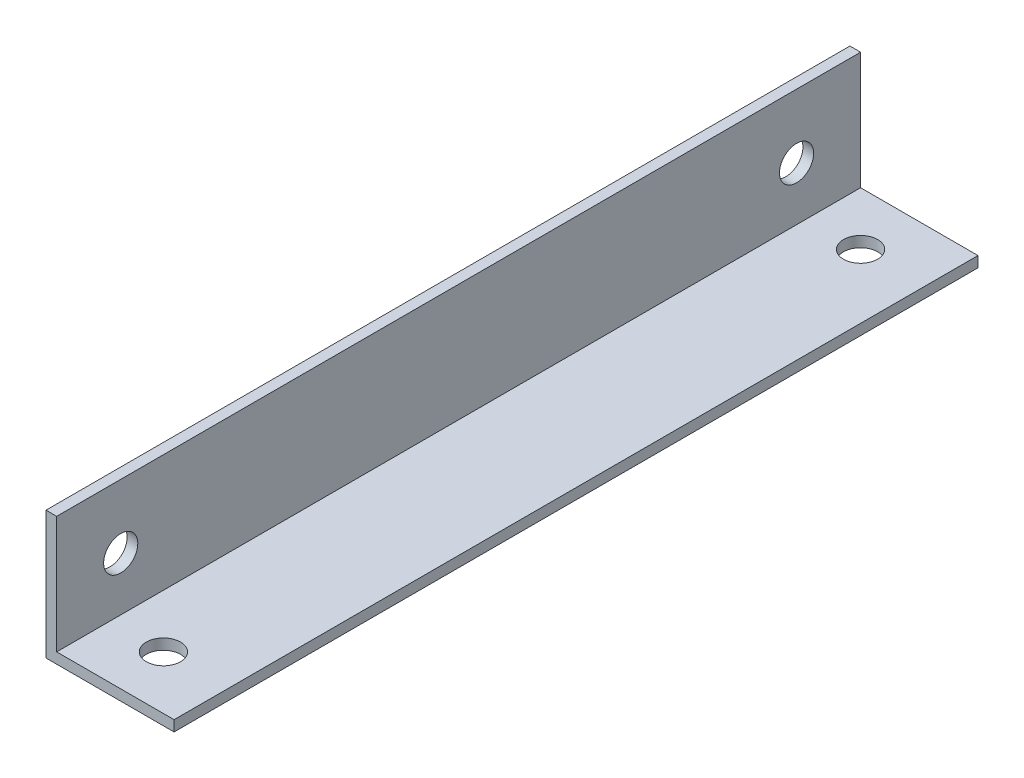
ISO-10303-21;
HEADER;
FILE_DESCRIPTION(('STEP AP214'),'2;1');
FILE_NAME('part.step','',(''),(''),'','','');
FILE_SCHEMA(('AUTOMOTIVE_DESIGN { 1 0 10303 214 1 1 1 1 }'));
ENDSEC;
DATA;
#1=APPLICATION_CONTEXT('core data for automotive mechanical design processes');
#2=APPLICATION_PROTOCOL_DEFINITION('international standard','automotive_design',2000,#1);
#3=PRODUCT_CONTEXT('',#1,'mechanical');
#4=PRODUCT('Part','Part','',(#3));
#5=PRODUCT_RELATED_PRODUCT_CATEGORY('part','',(#4));
#6=PRODUCT_DEFINITION_FORMATION('','',#4);
#7=PRODUCT_DEFINITION_CONTEXT('part definition',#1,'design');
#8=PRODUCT_DEFINITION('design','',#6,#7);
#9=PRODUCT_DEFINITION_SHAPE('','',#8);
#10=(LENGTH_UNIT() NAMED_UNIT(*) SI_UNIT(.MILLI.,.METRE.));
#11=(NAMED_UNIT(*) PLANE_ANGLE_UNIT() SI_UNIT($,.RADIAN.));
#12=(NAMED_UNIT(*) SI_UNIT($,.STERADIAN.) SOLID_ANGLE_UNIT());
#13=UNCERTAINTY_MEASURE_WITH_UNIT(LENGTH_MEASURE(1.E-05),#10,'distance_accuracy_value','');
#14=(GEOMETRIC_REPRESENTATION_CONTEXT(3) GLOBAL_UNCERTAINTY_ASSIGNED_CONTEXT((#13)) GLOBAL_UNIT_ASSIGNED_CONTEXT((#10,
#11,#12)) REPRESENTATION_CONTEXT('',''));
#15=CARTESIAN_POINT('',(0.,0.,0.));
#16=DIRECTION('',(0.,0.,1.));
#17=DIRECTION('',(1.,0.,0.));
#18=AXIS2_PLACEMENT_3D('',#15,#16,#17);
#19=CARTESIAN_POINT('',(30.,0.,188.3));
#20=DIRECTION('',(0.,1.,0.));
#21=DIRECTION('',(-1.,0.,0.));
#22=AXIS2_PLACEMENT_3D('',#19,#20,#21);
#23=PLANE('',#22);
#24=CARTESIAN_POINT('',(15.,0.,175.8));
#25=DIRECTION('',(0.,1.,0.));
#26=DIRECTION('',(1.,0.,0.));
#27=AXIS2_PLACEMENT_3D('',#24,#25,#26);
#28=CIRCLE('',#27,4.);
#29=CARTESIAN_POINT('',(11.,0.,175.8));
#30=VERTEX_POINT('',#29);
#31=EDGE_CURVE('E162',#30,#30,#28,.T.);
#32=ORIENTED_EDGE('',*,*,#31,.T.);
#33=EDGE_LOOP('',(#32));
#34=FACE_BOUND('',#33,.T.);
#35=CARTESIAN_POINT('',(15.,0.,12.5));
#36=DIRECTION('',(0.,1.,0.));
#37=DIRECTION('',(-1.,0.,0.));
#38=AXIS2_PLACEMENT_3D('',#35,#36,#37);
#39=CIRCLE('',#38,4.);
#40=CARTESIAN_POINT('',(11.,0.,12.5));
#41=VERTEX_POINT('',#40);
#42=EDGE_CURVE('E120',#41,#41,#39,.T.);
#43=ORIENTED_EDGE('',*,*,#42,.T.);
#44=EDGE_LOOP('',(#43));
#45=FACE_BOUND('',#44,.T.);
#46=DIRECTION('',(1.,0.,0.));
#47=VECTOR('',#46,1.);
#48=CARTESIAN_POINT('',(30.,0.,0.));
#49=LINE('',#48,#47);
#50=CARTESIAN_POINT('',(0.,0.,0.));
#51=VERTEX_POINT('',#50);
#52=CARTESIAN_POINT('',(30.,0.,0.));
#53=VERTEX_POINT('',#52);
#54=EDGE_CURVE('E116',#51,#53,#49,.T.);
#55=ORIENTED_EDGE('',*,*,#54,.T.);
#56=DIRECTION('',(0.,0.,-1.));
#57=VECTOR('',#56,1.);
#58=CARTESIAN_POINT('',(30.,0.,188.3));
#59=LINE('',#58,#57);
#60=CARTESIAN_POINT('',(30.,0.,188.3));
#61=VERTEX_POINT('',#60);
#62=EDGE_CURVE('E11',#61,#53,#59,.T.);
#63=ORIENTED_EDGE('',*,*,#62,.F.);
#64=DIRECTION('',(1.,0.,0.));
#65=VECTOR('',#64,1.);
#66=CARTESIAN_POINT('',(30.,0.,188.3));
#67=LINE('',#66,#65);
#68=CARTESIAN_POINT('',(0.,0.,188.3));
#69=VERTEX_POINT('',#68);
#70=EDGE_CURVE('E127',#69,#61,#67,.T.);
#71=ORIENTED_EDGE('',*,*,#70,.F.);
#72=DIRECTION('',(0.,0.,-1.));
#73=VECTOR('',#72,1.);
#74=CARTESIAN_POINT('',(0.,0.,188.3));
#75=LINE('',#74,#73);
#76=EDGE_CURVE('E112',#69,#51,#75,.T.);
#77=ORIENTED_EDGE('',*,*,#76,.T.);
#78=EDGE_LOOP('',(#55,#63,#71,#77));
#79=FACE_BOUND('',#78,.T.);
#80=ADVANCED_FACE('F32',(#34,#45,#79),#23,.F.);
#81=CARTESIAN_POINT('',(30.,2.5,188.3));
#82=DIRECTION('',(-1.,0.,0.));
#83=DIRECTION('',(0.,0.,1.));
#84=AXIS2_PLACEMENT_3D('',#81,#82,#83);
#85=PLANE('',#84);
#86=DIRECTION('',(0.,1.,0.));
#87=VECTOR('',#86,1.);
#88=CARTESIAN_POINT('',(30.,2.5,0.));
#89=LINE('',#88,#87);
#90=CARTESIAN_POINT('',(30.,2.5,0.));
#91=VERTEX_POINT('',#90);
#92=EDGE_CURVE('E119',#53,#91,#89,.T.);
#93=ORIENTED_EDGE('',*,*,#92,.T.);
#94=DIRECTION('',(0.,0.,-1.));
#95=VECTOR('',#94,1.);
#96=CARTESIAN_POINT('',(30.,2.5,188.3));
#97=LINE('',#96,#95);
#98=CARTESIAN_POINT('',(30.,2.5,188.3));
#99=VERTEX_POINT('',#98);
#100=EDGE_CURVE('E40',#99,#91,#97,.T.);
#101=ORIENTED_EDGE('',*,*,#100,.F.);
#102=DIRECTION('',(0.,1.,0.));
#103=VECTOR('',#102,1.);
#104=CARTESIAN_POINT('',(30.,2.5,188.3));
#105=LINE('',#104,#103);
#106=EDGE_CURVE('E85',#61,#99,#105,.T.);
#107=ORIENTED_EDGE('',*,*,#106,.F.);
#108=ORIENTED_EDGE('',*,*,#62,.T.);
#109=EDGE_LOOP('',(#93,#101,#107,#108));
#110=FACE_BOUND('',#109,.T.);
#111=ADVANCED_FACE('F154',(#110),#85,.F.);
#112=CARTESIAN_POINT('',(2.5,2.5,188.3));
#113=DIRECTION('',(0.,-1.,0.));
#114=DIRECTION('',(1.,0.,0.));
#115=AXIS2_PLACEMENT_3D('',#112,#113,#114);
#116=PLANE('',#115);
#117=CARTESIAN_POINT('',(15.,2.5,175.8));
#118=DIRECTION('',(0.,1.,0.));
#119=DIRECTION('',(1.,0.,0.));
#120=AXIS2_PLACEMENT_3D('',#117,#118,#119);
#121=CIRCLE('',#120,4.);
#122=CARTESIAN_POINT('',(11.,2.5,175.8));
#123=VERTEX_POINT('',#122);
#124=EDGE_CURVE('E171',#123,#123,#121,.T.);
#125=ORIENTED_EDGE('',*,*,#124,.F.);
#126=EDGE_LOOP('',(#125));
#127=FACE_BOUND('',#126,.T.);
#128=CARTESIAN_POINT('',(15.,2.5,12.5));
#129=DIRECTION('',(0.,1.,0.));
#130=DIRECTION('',(-1.,0.,0.));
#131=AXIS2_PLACEMENT_3D('',#128,#129,#130);
#132=CIRCLE('',#131,4.);
#133=CARTESIAN_POINT('',(11.,2.5,12.5));
#134=VERTEX_POINT('',#133);
#135=EDGE_CURVE('E166',#134,#134,#132,.T.);
#136=ORIENTED_EDGE('',*,*,#135,.F.);
#137=EDGE_LOOP('',(#136));
#138=FACE_BOUND('',#137,.T.);
#139=DIRECTION('',(-1.,0.,0.));
#140=VECTOR('',#139,1.);
#141=CARTESIAN_POINT('',(2.5,2.5,0.));
#142=LINE('',#141,#140);
#143=CARTESIAN_POINT('',(2.5,2.5,0.));
#144=VERTEX_POINT('',#143);
#145=EDGE_CURVE('E122',#91,#144,#142,.T.);
#146=ORIENTED_EDGE('',*,*,#145,.T.);
#147=DIRECTION('',(0.,0.,-1.));
#148=VECTOR('',#147,1.);
#149=CARTESIAN_POINT('',(2.5,2.5,188.3));
#150=LINE('',#149,#148);
#151=CARTESIAN_POINT('',(2.5,2.5,188.3));
#152=VERTEX_POINT('',#151);
#153=EDGE_CURVE('E107',#152,#144,#150,.T.);
#154=ORIENTED_EDGE('',*,*,#153,.F.);
#155=DIRECTION('',(-1.,0.,0.));
#156=VECTOR('',#155,1.);
#157=CARTESIAN_POINT('',(2.5,2.5,188.3));
#158=LINE('',#157,#156);
#159=EDGE_CURVE('E98',#99,#152,#158,.T.);
#160=ORIENTED_EDGE('',*,*,#159,.F.);
#161=ORIENTED_EDGE('',*,*,#100,.T.);
#162=EDGE_LOOP('',(#146,#154,#160,#161));
#163=FACE_BOUND('',#162,.T.);
#164=ADVANCED_FACE('F133',(#127,#138,#163),#116,.F.);
#165=CARTESIAN_POINT('',(2.5,30.,188.3));
#166=DIRECTION('',(-1.,0.,0.));
#167=DIRECTION('',(0.,-1.,0.));
#168=AXIS2_PLACEMENT_3D('',#165,#166,#167);
#169=PLANE('',#168);
#170=CARTESIAN_POINT('',(2.5,15.,173.3));
#171=DIRECTION('',(1.,0.,0.));
#172=DIRECTION('',(0.,-1.,0.));
#173=AXIS2_PLACEMENT_3D('',#170,#171,#172);
#174=CIRCLE('',#173,3.99999999999996);
#175=CARTESIAN_POINT('',(2.5,11.,173.3));
#176=VERTEX_POINT('',#175);
#177=EDGE_CURVE('E184',#176,#176,#174,.T.);
#178=ORIENTED_EDGE('',*,*,#177,.F.);
#179=EDGE_LOOP('',(#178));
#180=FACE_BOUND('',#179,.T.);
#181=CARTESIAN_POINT('',(2.5,15.,15.));
#182=DIRECTION('',(1.,0.,0.));
#183=DIRECTION('',(0.,1.,0.));
#184=AXIS2_PLACEMENT_3D('',#181,#182,#183);
#185=CIRCLE('',#184,4.);
#186=CARTESIAN_POINT('',(2.5,19.,15.));
#187=VERTEX_POINT('',#186);
#188=EDGE_CURVE('E178',#187,#187,#185,.T.);
#189=ORIENTED_EDGE('',*,*,#188,.F.);
#190=EDGE_LOOP('',(#189));
#191=FACE_BOUND('',#190,.T.);
#192=DIRECTION('',(0.,1.,0.));
#193=VECTOR('',#192,1.);
#194=CARTESIAN_POINT('',(2.5,30.,0.));
#195=LINE('',#194,#193);
#196=CARTESIAN_POINT('',(2.5,30.,0.));
#197=VERTEX_POINT('',#196);
#198=EDGE_CURVE('E106',#144,#197,#195,.T.);
#199=ORIENTED_EDGE('',*,*,#198,.T.);
#200=DIRECTION('',(0.,0.,-1.));
#201=VECTOR('',#200,1.);
#202=CARTESIAN_POINT('',(2.5,30.,188.3));
#203=LINE('',#202,#201);
#204=CARTESIAN_POINT('',(2.5,30.,188.3));
#205=VERTEX_POINT('',#204);
#206=EDGE_CURVE('E103',#205,#197,#203,.T.);
#207=ORIENTED_EDGE('',*,*,#206,.F.);
#208=DIRECTION('',(0.,1.,0.));
#209=VECTOR('',#208,1.);
#210=CARTESIAN_POINT('',(2.5,30.,188.3));
#211=LINE('',#210,#209);
#212=EDGE_CURVE('E92',#152,#205,#211,.T.);
#213=ORIENTED_EDGE('',*,*,#212,.F.);
#214=ORIENTED_EDGE('',*,*,#153,.T.);
#215=EDGE_LOOP('',(#199,#207,#213,#214));
#216=FACE_BOUND('',#215,.T.);
#217=ADVANCED_FACE('F104',(#180,#191,#216),#169,.F.);
#218=CARTESIAN_POINT('',(0.,30.,188.3));
#219=DIRECTION('',(0.,-1.,0.));
#220=DIRECTION('',(0.,0.,-1.));
#221=AXIS2_PLACEMENT_3D('',#218,#219,#220);
#222=PLANE('',#221);
#223=DIRECTION('',(-1.,0.,0.));
#224=VECTOR('',#223,1.);
#225=CARTESIAN_POINT('',(0.,30.,0.));
#226=LINE('',#225,#224);
#227=CARTESIAN_POINT('',(0.,30.,0.));
#228=VERTEX_POINT('',#227);
#229=EDGE_CURVE('E71',#197,#228,#226,.T.);
#230=ORIENTED_EDGE('',*,*,#229,.T.);
#231=DIRECTION('',(0.,0.,-1.));
#232=VECTOR('',#231,1.);
#233=CARTESIAN_POINT('',(0.,30.,188.3));
#234=LINE('',#233,#232);
#235=CARTESIAN_POINT('',(0.,30.,188.3));
#236=VERTEX_POINT('',#235);
#237=EDGE_CURVE('E108',#236,#228,#234,.T.);
#238=ORIENTED_EDGE('',*,*,#237,.F.);
#239=DIRECTION('',(-1.,0.,0.));
#240=VECTOR('',#239,1.);
#241=CARTESIAN_POINT('',(0.,30.,188.3));
#242=LINE('',#241,#240);
#243=EDGE_CURVE('E96',#205,#236,#242,.T.);
#244=ORIENTED_EDGE('',*,*,#243,.F.);
#245=ORIENTED_EDGE('',*,*,#206,.T.);
#246=EDGE_LOOP('',(#230,#238,#244,#245));
#247=FACE_BOUND('',#246,.T.);
#248=ADVANCED_FACE('F110',(#247),#222,.F.);
#249=CARTESIAN_POINT('',(0.,0.,188.3));
#250=DIRECTION('',(1.,0.,0.));
#251=DIRECTION('',(0.,0.,-1.));
#252=AXIS2_PLACEMENT_3D('',#249,#250,#251);
#253=PLANE('',#252);
#254=CARTESIAN_POINT('',(0.,15.,173.3));
#255=DIRECTION('',(1.,0.,0.));
#256=DIRECTION('',(0.,-1.,0.));
#257=AXIS2_PLACEMENT_3D('',#254,#255,#256);
#258=CIRCLE('',#257,3.99999999999996);
#259=CARTESIAN_POINT('',(0.,11.,173.3));
#260=VERTEX_POINT('',#259);
#261=EDGE_CURVE('E181',#260,#260,#258,.T.);
#262=ORIENTED_EDGE('',*,*,#261,.T.);
#263=EDGE_LOOP('',(#262));
#264=FACE_BOUND('',#263,.T.);
#265=CARTESIAN_POINT('',(0.,15.,15.));
#266=DIRECTION('',(1.,0.,0.));
#267=DIRECTION('',(0.,1.,0.));
#268=AXIS2_PLACEMENT_3D('',#265,#266,#267);
#269=CIRCLE('',#268,4.);
#270=CARTESIAN_POINT('',(0.,19.,15.));
#271=VERTEX_POINT('',#270);
#272=EDGE_CURVE('E176',#271,#271,#269,.T.);
#273=ORIENTED_EDGE('',*,*,#272,.T.);
#274=EDGE_LOOP('',(#273));
#275=FACE_BOUND('',#274,.T.);
#276=DIRECTION('',(0.,-1.,0.));
#277=VECTOR('',#276,1.);
#278=CARTESIAN_POINT('',(0.,0.,0.));
#279=LINE('',#278,#277);
#280=EDGE_CURVE('E77',#228,#51,#279,.T.);
#281=ORIENTED_EDGE('',*,*,#280,.T.);
#282=ORIENTED_EDGE('',*,*,#76,.F.);
#283=DIRECTION('',(0.,-1.,0.));
#284=VECTOR('',#283,1.);
#285=CARTESIAN_POINT('',(0.,0.,188.3));
#286=LINE('',#285,#284);
#287=EDGE_CURVE('E48',#236,#69,#286,.T.);
#288=ORIENTED_EDGE('',*,*,#287,.F.);
#289=ORIENTED_EDGE('',*,*,#237,.T.);
#290=EDGE_LOOP('',(#281,#282,#288,#289));
#291=FACE_BOUND('',#290,.T.);
#292=ADVANCED_FACE('F140',(#264,#275,#291),#253,.F.);
#293=CARTESIAN_POINT('',(0.,0.,188.3));
#294=DIRECTION('',(0.,0.,-1.));
#295=DIRECTION('',(-1.,0.,0.));
#296=AXIS2_PLACEMENT_3D('',#293,#294,#295);
#297=PLANE('',#296);
#298=ORIENTED_EDGE('',*,*,#70,.T.);
#299=ORIENTED_EDGE('',*,*,#106,.T.);
#300=ORIENTED_EDGE('',*,*,#159,.T.);
#301=ORIENTED_EDGE('',*,*,#212,.T.);
#302=ORIENTED_EDGE('',*,*,#243,.T.);
#303=ORIENTED_EDGE('',*,*,#287,.T.);
#304=EDGE_LOOP('',(#298,#299,#300,#301,#302,#303));
#305=FACE_BOUND('',#304,.T.);
#306=ADVANCED_FACE('F94',(#305),#297,.F.);
#307=CARTESIAN_POINT('',(0.,0.,0.));
#308=DIRECTION('',(0.,0.,-1.));
#309=DIRECTION('',(-1.,0.,0.));
#310=AXIS2_PLACEMENT_3D('',#307,#308,#309);
#311=PLANE('',#310);
#312=ORIENTED_EDGE('',*,*,#54,.F.);
#313=ORIENTED_EDGE('',*,*,#280,.F.);
#314=ORIENTED_EDGE('',*,*,#229,.F.);
#315=ORIENTED_EDGE('',*,*,#198,.F.);
#316=ORIENTED_EDGE('',*,*,#145,.F.);
#317=ORIENTED_EDGE('',*,*,#92,.F.);
#318=EDGE_LOOP('',(#312,#313,#314,#315,#316,#317));
#319=FACE_BOUND('',#318,.T.);
#320=ADVANCED_FACE('F136',(#319),#311,.T.);
#321=CARTESIAN_POINT('',(15.,0.,12.5));
#322=DIRECTION('',(0.,1.,0.));
#323=DIRECTION('',(-1.,0.,0.));
#324=AXIS2_PLACEMENT_3D('',#321,#322,#323);
#325=CYLINDRICAL_SURFACE('',#324,4.);
#326=CARTESIAN_POINT('',(11.,0.,12.5));
#327=CARTESIAN_POINT('',(11.,0.0260416666666661,12.5));
#328=CARTESIAN_POINT('',(11.,0.0520833333333328,12.5));
#329=CARTESIAN_POINT('',(11.,0.104166666666666,12.5));
#330=CARTESIAN_POINT('',(11.,0.130208333333333,12.5));
#331=CARTESIAN_POINT('',(11.,0.182291666666666,12.5));
#332=CARTESIAN_POINT('',(11.,0.208333333333333,12.5));
#333=CARTESIAN_POINT('',(11.,0.260416666666666,12.5));
#334=CARTESIAN_POINT('',(11.,0.286458333333333,12.5));
#335=CARTESIAN_POINT('',(11.,0.338541666666666,12.5));
#336=CARTESIAN_POINT('',(11.,0.364583333333333,12.5));
#337=CARTESIAN_POINT('',(11.,0.416666666666666,12.5));
#338=CARTESIAN_POINT('',(11.,0.442708333333333,12.5));
#339=CARTESIAN_POINT('',(11.,0.494791666666666,12.5));
#340=CARTESIAN_POINT('',(11.,0.520833333333333,12.5));
#341=CARTESIAN_POINT('',(11.,0.572916666666666,12.5));
#342=CARTESIAN_POINT('',(11.,0.598958333333333,12.5));
#343=CARTESIAN_POINT('',(11.,0.651041666666666,12.5));
#344=CARTESIAN_POINT('',(11.,0.677083333333333,12.5));
#345=CARTESIAN_POINT('',(11.,0.729166666666667,12.5));
#346=CARTESIAN_POINT('',(11.,0.755208333333333,12.5));
#347=CARTESIAN_POINT('',(11.,0.807291666666666,12.5));
#348=CARTESIAN_POINT('',(11.,0.833333333333333,12.5));
#349=CARTESIAN_POINT('',(11.,0.885416666666667,12.5));
#350=CARTESIAN_POINT('',(11.,0.911458333333333,12.5));
#351=CARTESIAN_POINT('',(11.,0.963541666666667,12.5));
#352=CARTESIAN_POINT('',(11.,0.989583333333333,12.5));
#353=CARTESIAN_POINT('',(11.,1.04166666666667,12.5));
#354=CARTESIAN_POINT('',(11.,1.06770833333333,12.5));
#355=CARTESIAN_POINT('',(11.,1.11979166666667,12.5));
#356=CARTESIAN_POINT('',(11.,1.14583333333333,12.5));
#357=CARTESIAN_POINT('',(11.,1.19791666666667,12.5));
#358=CARTESIAN_POINT('',(11.,1.22395833333333,12.5));
#359=CARTESIAN_POINT('',(11.,1.27604166666667,12.5));
#360=CARTESIAN_POINT('',(11.,1.30208333333333,12.5));
#361=CARTESIAN_POINT('',(11.,1.35416666666667,12.5));
#362=CARTESIAN_POINT('',(11.,1.38020833333333,12.5));
#363=CARTESIAN_POINT('',(11.,1.43229166666667,12.5));
#364=CARTESIAN_POINT('',(11.,1.45833333333333,12.5));
#365=CARTESIAN_POINT('',(11.,1.51041666666667,12.5));
#366=CARTESIAN_POINT('',(11.,1.53645833333333,12.5));
#367=CARTESIAN_POINT('',(11.,1.58854166666667,12.5));
#368=CARTESIAN_POINT('',(11.,1.61458333333333,12.5));
#369=CARTESIAN_POINT('',(11.,1.66666666666667,12.5));
#370=CARTESIAN_POINT('',(11.,1.69270833333333,12.5));
#371=CARTESIAN_POINT('',(11.,1.74479166666667,12.5));
#372=CARTESIAN_POINT('',(11.,1.77083333333333,12.5));
#373=CARTESIAN_POINT('',(11.,1.82291666666667,12.5));
#374=CARTESIAN_POINT('',(11.,1.84895833333333,12.5));
#375=CARTESIAN_POINT('',(11.,1.90104166666667,12.5));
#376=CARTESIAN_POINT('',(11.,1.92708333333333,12.5));
#377=CARTESIAN_POINT('',(11.,1.97916666666667,12.5));
#378=CARTESIAN_POINT('',(11.,2.00520833333333,12.5));
#379=CARTESIAN_POINT('',(11.,2.05729166666667,12.5));
#380=CARTESIAN_POINT('',(11.,2.08333333333333,12.5));
#381=CARTESIAN_POINT('',(11.,2.13541666666667,12.5));
#382=CARTESIAN_POINT('',(11.,2.16145833333333,12.5));
#383=CARTESIAN_POINT('',(11.,2.21354166666667,12.5));
#384=CARTESIAN_POINT('',(11.,2.23958333333333,12.5));
#385=CARTESIAN_POINT('',(11.,2.29166666666667,12.5));
#386=CARTESIAN_POINT('',(11.,2.31770833333333,12.5));
#387=CARTESIAN_POINT('',(11.,2.36979166666667,12.5));
#388=CARTESIAN_POINT('',(11.,2.39583333333333,12.5));
#389=CARTESIAN_POINT('',(11.,2.44791666666667,12.5));
#390=CARTESIAN_POINT('',(11.,2.47395833333333,12.5));
#391=CARTESIAN_POINT('',(11.,2.5,12.5));
#392=B_SPLINE_CURVE_WITH_KNOTS('',3,(#326,#327,#328,#329,#330,#331,#332,#333,#334,#335,#336,
#337,#338,#339,#340,#341,#342,#343,#344,#345,#346,#347,#348,#349,#350,#351,#352,#353,#354,#355,
#356,#357,#358,#359,#360,#361,#362,#363,#364,#365,#366,#367,#368,#369,#370,#371,#372,#373,#374,
#375,#376,#377,#378,#379,#380,#381,#382,#383,#384,#385,#386,#387,#388,#389,#390,#391),
.UNSPECIFIED.,.F.,.F.,(4,2,2,2,2,2,2,2,2,2,2,2,2,2,2,2,2,2,2,2,2,2,2,2,2,2,2,2,2,2,2,2,4),(0.,
0.078125,0.15625,0.234375,0.3125,0.390625,0.46875,0.546875,0.625,0.703125,0.78125,0.859375,
0.9375,1.015625,1.09375,1.171875,1.25,1.328125,1.40625,1.484375,1.5625,1.640625,1.71875,
1.796875,1.875,1.953125,2.03125,2.109375,2.1875,2.265625,2.34375,2.421875,2.5),.UNSPECIFIED.);
#393=EDGE_CURVE('BSEAM208',#41,#134,#392,.T.);
#394=ORIENTED_EDGE('',*,*,#42,.F.);
#395=ORIENTED_EDGE('',*,*,#135,.T.);
#396=ORIENTED_EDGE('',*,*,#393,.T.);
#397=ORIENTED_EDGE('',*,*,#393,.F.);
#398=EDGE_LOOP('',(#394,#396,#395,#397));
#399=FACE_BOUND('',#398,.T.);
#400=ADVANCED_FACE('F208',(#399),#325,.F.);
#401=CARTESIAN_POINT('',(15.,0.,175.8));
#402=DIRECTION('',(0.,1.,0.));
#403=DIRECTION('',(-1.,0.,0.));
#404=AXIS2_PLACEMENT_3D('',#401,#402,#403);
#405=CYLINDRICAL_SURFACE('',#404,4.);
#406=CARTESIAN_POINT('',(11.,0.,175.8));
#407=CARTESIAN_POINT('',(11.,0.0260416666666661,175.8));
#408=CARTESIAN_POINT('',(11.,0.0520833333333328,175.8));
#409=CARTESIAN_POINT('',(11.,0.104166666666666,175.8));
#410=CARTESIAN_POINT('',(11.,0.130208333333333,175.8));
#411=CARTESIAN_POINT('',(11.,0.182291666666666,175.8));
#412=CARTESIAN_POINT('',(11.,0.208333333333333,175.8));
#413=CARTESIAN_POINT('',(11.,0.260416666666666,175.8));
#414=CARTESIAN_POINT('',(11.,0.286458333333333,175.8));
#415=CARTESIAN_POINT('',(11.,0.338541666666666,175.8));
#416=CARTESIAN_POINT('',(11.,0.364583333333333,175.8));
#417=CARTESIAN_POINT('',(11.,0.416666666666666,175.8));
#418=CARTESIAN_POINT('',(11.,0.442708333333333,175.8));
#419=CARTESIAN_POINT('',(11.,0.494791666666666,175.8));
#420=CARTESIAN_POINT('',(11.,0.520833333333333,175.8));
#421=CARTESIAN_POINT('',(11.,0.572916666666666,175.8));
#422=CARTESIAN_POINT('',(11.,0.598958333333333,175.8));
#423=CARTESIAN_POINT('',(11.,0.651041666666666,175.8));
#424=CARTESIAN_POINT('',(11.,0.677083333333333,175.8));
#425=CARTESIAN_POINT('',(11.,0.729166666666667,175.8));
#426=CARTESIAN_POINT('',(11.,0.755208333333333,175.8));
#427=CARTESIAN_POINT('',(11.,0.807291666666666,175.8));
#428=CARTESIAN_POINT('',(11.,0.833333333333333,175.8));
#429=CARTESIAN_POINT('',(11.,0.885416666666667,175.8));
#430=CARTESIAN_POINT('',(11.,0.911458333333333,175.8));
#431=CARTESIAN_POINT('',(11.,0.963541666666667,175.8));
#432=CARTESIAN_POINT('',(11.,0.989583333333333,175.8));
#433=CARTESIAN_POINT('',(11.,1.04166666666667,175.8));
#434=CARTESIAN_POINT('',(11.,1.06770833333333,175.8));
#435=CARTESIAN_POINT('',(11.,1.11979166666667,175.8));
#436=CARTESIAN_POINT('',(11.,1.14583333333333,175.8));
#437=CARTESIAN_POINT('',(11.,1.19791666666667,175.8));
#438=CARTESIAN_POINT('',(11.,1.22395833333333,175.8));
#439=CARTESIAN_POINT('',(11.,1.27604166666667,175.8));
#440=CARTESIAN_POINT('',(11.,1.30208333333333,175.8));
#441=CARTESIAN_POINT('',(11.,1.35416666666667,175.8));
#442=CARTESIAN_POINT('',(11.,1.38020833333333,175.8));
#443=CARTESIAN_POINT('',(11.,1.43229166666667,175.8));
#444=CARTESIAN_POINT('',(11.,1.45833333333333,175.8));
#445=CARTESIAN_POINT('',(11.,1.51041666666667,175.8));
#446=CARTESIAN_POINT('',(11.,1.53645833333333,175.8));
#447=CARTESIAN_POINT('',(11.,1.58854166666667,175.8));
#448=CARTESIAN_POINT('',(11.,1.61458333333333,175.8));
#449=CARTESIAN_POINT('',(11.,1.66666666666667,175.8));
#450=CARTESIAN_POINT('',(11.,1.69270833333333,175.8));
#451=CARTESIAN_POINT('',(11.,1.74479166666667,175.8));
#452=CARTESIAN_POINT('',(11.,1.77083333333333,175.8));
#453=CARTESIAN_POINT('',(11.,1.82291666666667,175.8));
#454=CARTESIAN_POINT('',(11.,1.84895833333333,175.8));
#455=CARTESIAN_POINT('',(11.,1.90104166666667,175.8));
#456=CARTESIAN_POINT('',(11.,1.92708333333333,175.8));
#457=CARTESIAN_POINT('',(11.,1.97916666666667,175.8));
#458=CARTESIAN_POINT('',(11.,2.00520833333333,175.8));
#459=CARTESIAN_POINT('',(11.,2.05729166666667,175.8));
#460=CARTESIAN_POINT('',(11.,2.08333333333333,175.8));
#461=CARTESIAN_POINT('',(11.,2.13541666666667,175.8));
#462=CARTESIAN_POINT('',(11.,2.16145833333333,175.8));
#463=CARTESIAN_POINT('',(11.,2.21354166666667,175.8));
#464=CARTESIAN_POINT('',(11.,2.23958333333333,175.8));
#465=CARTESIAN_POINT('',(11.,2.29166666666667,175.8));
#466=CARTESIAN_POINT('',(11.,2.31770833333333,175.8));
#467=CARTESIAN_POINT('',(11.,2.36979166666667,175.8));
#468=CARTESIAN_POINT('',(11.,2.39583333333333,175.8));
#469=CARTESIAN_POINT('',(11.,2.44791666666667,175.8));
#470=CARTESIAN_POINT('',(11.,2.47395833333333,175.8));
#471=CARTESIAN_POINT('',(11.,2.5,175.8));
#472=B_SPLINE_CURVE_WITH_KNOTS('',3,(#406,#407,#408,#409,#410,#411,#412,#413,#414,#415,#416,
#417,#418,#419,#420,#421,#422,#423,#424,#425,#426,#427,#428,#429,#430,#431,#432,#433,#434,#435,
#436,#437,#438,#439,#440,#441,#442,#443,#444,#445,#446,#447,#448,#449,#450,#451,#452,#453,#454,
#455,#456,#457,#458,#459,#460,#461,#462,#463,#464,#465,#466,#467,#468,#469,#470,#471),
.UNSPECIFIED.,.F.,.F.,(4,2,2,2,2,2,2,2,2,2,2,2,2,2,2,2,2,2,2,2,2,2,2,2,2,2,2,2,2,2,2,2,4),(0.,
0.078125,0.15625,0.234375,0.3125,0.390625,0.46875,0.546875,0.625,0.703125,0.78125,0.859375,
0.9375,1.015625,1.09375,1.171875,1.25,1.328125,1.40625,1.484375,1.5625,1.640625,1.71875,
1.796875,1.875,1.953125,2.03125,2.109375,2.1875,2.265625,2.34375,2.421875,2.5),.UNSPECIFIED.);
#473=EDGE_CURVE('BSEAM202',#30,#123,#472,.T.);
#474=ORIENTED_EDGE('',*,*,#31,.F.);
#475=ORIENTED_EDGE('',*,*,#124,.T.);
#476=ORIENTED_EDGE('',*,*,#473,.T.);
#477=ORIENTED_EDGE('',*,*,#473,.F.);
#478=EDGE_LOOP('',(#474,#476,#475,#477));
#479=FACE_BOUND('',#478,.T.);
#480=ADVANCED_FACE('F202',(#479),#405,.F.);
#481=CARTESIAN_POINT('',(0.,15.,15.));
#482=DIRECTION('',(1.,0.,0.));
#483=DIRECTION('',(0.,1.,0.));
#484=AXIS2_PLACEMENT_3D('',#481,#482,#483);
#485=CYLINDRICAL_SURFACE('',#484,4.);
#486=ORIENTED_EDGE('',*,*,#272,.F.);
#487=EDGE_LOOP('',(#486));
#488=FACE_BOUND('',#487,.T.);
#489=ORIENTED_EDGE('',*,*,#188,.T.);
#490=EDGE_LOOP('',(#489));
#491=FACE_BOUND('',#490,.T.);
#492=ADVANCED_FACE('F192',(#488,#491),#485,.F.);
#493=CARTESIAN_POINT('',(0.,15.,173.3));
#494=DIRECTION('',(1.,0.,0.));
#495=DIRECTION('',(0.,1.,0.));
#496=AXIS2_PLACEMENT_3D('',#493,#494,#495);
#497=CYLINDRICAL_SURFACE('',#496,3.99999999999996);
#498=ORIENTED_EDGE('',*,*,#261,.F.);
#499=EDGE_LOOP('',(#498));
#500=FACE_BOUND('',#499,.T.);
#501=ORIENTED_EDGE('',*,*,#177,.T.);
#502=EDGE_LOOP('',(#501));
#503=FACE_BOUND('',#502,.T.);
#504=ADVANCED_FACE('F189',(#500,#503),#497,.F.);
#505=CLOSED_SHELL('',(#80,#111,#164,#217,#248,#292,#306,#320,#400,#480,#492,#504));
#506=MANIFOLD_SOLID_BREP('B2',#505);
#507=ADVANCED_BREP_SHAPE_REPRESENTATION('',(#18,#506),#14);
#508=SHAPE_DEFINITION_REPRESENTATION(#9,#507);
ENDSEC;
END-ISO-10303-21;
